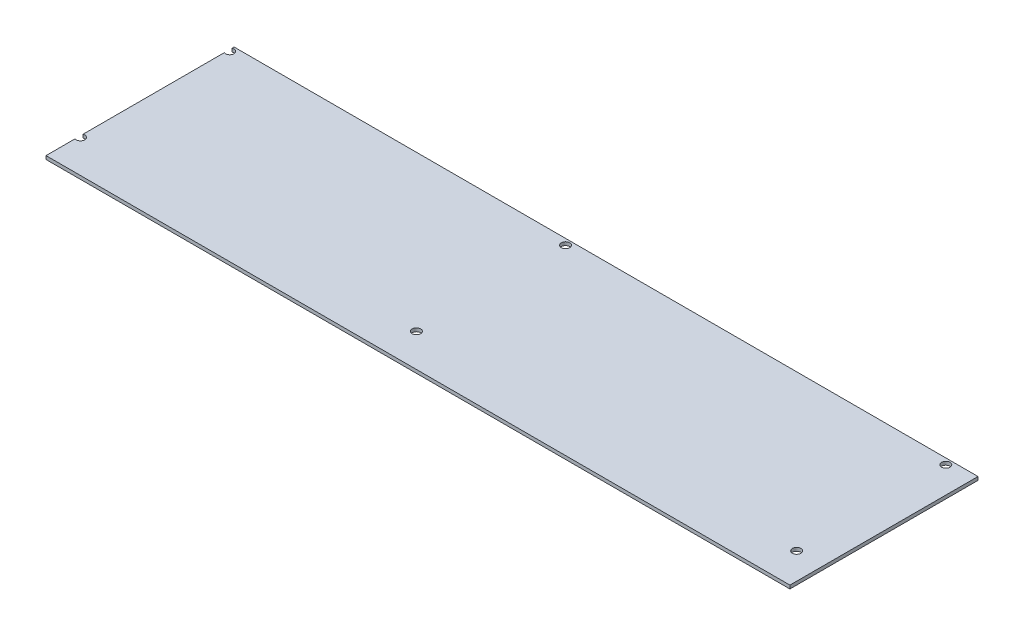
ISO-10303-21;
HEADER;
FILE_DESCRIPTION(('STEP AP214'),'2;1');
FILE_NAME('part.step','',(''),(''),'','','');
FILE_SCHEMA(('AUTOMOTIVE_DESIGN { 1 0 10303 214 1 1 1 1 }'));
ENDSEC;
DATA;
#1=APPLICATION_CONTEXT('core data for automotive mechanical design processes');
#2=APPLICATION_PROTOCOL_DEFINITION('international standard','automotive_design',2000,#1);
#3=PRODUCT_CONTEXT('',#1,'mechanical');
#4=PRODUCT('Part','Part','',(#3));
#5=PRODUCT_RELATED_PRODUCT_CATEGORY('part','',(#4));
#6=PRODUCT_DEFINITION_FORMATION('','',#4);
#7=PRODUCT_DEFINITION_CONTEXT('part definition',#1,'design');
#8=PRODUCT_DEFINITION('design','',#6,#7);
#9=PRODUCT_DEFINITION_SHAPE('','',#8);
#10=(LENGTH_UNIT() NAMED_UNIT(*) SI_UNIT(.MILLI.,.METRE.));
#11=(NAMED_UNIT(*) PLANE_ANGLE_UNIT() SI_UNIT($,.RADIAN.));
#12=(NAMED_UNIT(*) SI_UNIT($,.STERADIAN.) SOLID_ANGLE_UNIT());
#13=UNCERTAINTY_MEASURE_WITH_UNIT(LENGTH_MEASURE(1.E-05),#10,'distance_accuracy_value','');
#14=(GEOMETRIC_REPRESENTATION_CONTEXT(3) GLOBAL_UNCERTAINTY_ASSIGNED_CONTEXT((#13)) GLOBAL_UNIT_ASSIGNED_CONTEXT((#10,
#11,#12)) REPRESENTATION_CONTEXT('',''));
#15=CARTESIAN_POINT('',(0.,0.,0.));
#16=DIRECTION('',(0.,0.,1.));
#17=DIRECTION('',(1.,0.,0.));
#18=AXIS2_PLACEMENT_3D('',#15,#16,#17);
#19=CARTESIAN_POINT('',(0.,3.175,0.));
#20=DIRECTION('',(1.,0.,0.));
#21=DIRECTION('',(0.,0.,-1.));
#22=AXIS2_PLACEMENT_3D('',#19,#20,#21);
#23=PLANE('',#22);
#24=DIRECTION('',(0.,0.,1.));
#25=VECTOR('',#24,1.);
#26=CARTESIAN_POINT('',(0.,0.,0.));
#27=LINE('',#26,#25);
#28=CARTESIAN_POINT('',(0.,0.,0.));
#29=VERTEX_POINT('',#28);
#30=CARTESIAN_POINT('',(0.,0.,1.86950884320933));
#31=VERTEX_POINT('',#30);
#32=EDGE_CURVE('E130',#29,#31,#27,.T.);
#33=ORIENTED_EDGE('',*,*,#32,.T.);
#34=DIRECTION('',(0.,1.,0.));
#35=VECTOR('',#34,1.);
#36=CARTESIAN_POINT('',(0.,0.,1.86950884320933));
#37=LINE('',#36,#35);
#38=CARTESIAN_POINT('',(0.,3.175,1.86950884320933));
#39=VERTEX_POINT('',#38);
#40=EDGE_CURVE('E68',#31,#39,#37,.T.);
#41=ORIENTED_EDGE('',*,*,#40,.T.);
#42=DIRECTION('',(0.,0.,1.));
#43=VECTOR('',#42,1.);
#44=CARTESIAN_POINT('',(0.,3.175,0.));
#45=LINE('',#44,#43);
#46=CARTESIAN_POINT('',(0.,3.175,0.));
#47=VERTEX_POINT('',#46);
#48=EDGE_CURVE('E162',#47,#39,#45,.T.);
#49=ORIENTED_EDGE('',*,*,#48,.F.);
#50=DIRECTION('',(0.,-1.,0.));
#51=VECTOR('',#50,1.);
#52=CARTESIAN_POINT('',(0.,3.175,0.));
#53=LINE('',#52,#51);
#54=EDGE_CURVE('E148',#47,#29,#53,.T.);
#55=ORIENTED_EDGE('',*,*,#54,.T.);
#56=EDGE_LOOP('',(#33,#41,#49,#55));
#57=FACE_BOUND('',#56,.T.);
#58=ADVANCED_FACE('F45',(#57),#23,.F.);
#59=CARTESIAN_POINT('',(0.,3.175,9.24299115679058));
#60=VERTEX_POINT('',#59);
#61=CARTESIAN_POINT('',(0.,3.175,141.569508843243));
#62=VERTEX_POINT('',#61);
#63=EDGE_CURVE('E166',#60,#62,#45,.T.);
#64=ORIENTED_EDGE('',*,*,#63,.F.);
#65=DIRECTION('',(0.,1.,0.));
#66=VECTOR('',#65,1.);
#67=CARTESIAN_POINT('',(0.,0.,9.24299115679058));
#68=LINE('',#67,#66);
#69=CARTESIAN_POINT('',(0.,0.,9.24299115679058));
#70=VERTEX_POINT('',#69);
#71=EDGE_CURVE('E179',#60,#70,#68,.F.);
#72=ORIENTED_EDGE('',*,*,#71,.T.);
#73=CARTESIAN_POINT('',(0.,0.,141.569508843243));
#74=VERTEX_POINT('',#73);
#75=EDGE_CURVE('E127',#70,#74,#27,.T.);
#76=ORIENTED_EDGE('',*,*,#75,.T.);
#77=DIRECTION('',(0.,1.,0.));
#78=VECTOR('',#77,1.);
#79=CARTESIAN_POINT('',(0.,0.,141.569508843243));
#80=LINE('',#79,#78);
#81=EDGE_CURVE('E60',#74,#62,#80,.T.);
#82=ORIENTED_EDGE('',*,*,#81,.T.);
#83=EDGE_LOOP('',(#64,#72,#76,#82));
#84=FACE_BOUND('',#83,.T.);
#85=ADVANCED_FACE('F226',(#84),#23,.F.);
#86=CARTESIAN_POINT('',(0.,3.175,148.942991156824));
#87=VERTEX_POINT('',#86);
#88=CARTESIAN_POINT('',(0.,3.175,176.2125));
#89=VERTEX_POINT('',#88);
#90=EDGE_CURVE('E120',#87,#89,#45,.T.);
#91=ORIENTED_EDGE('',*,*,#90,.F.);
#92=DIRECTION('',(0.,1.,0.));
#93=VECTOR('',#92,1.);
#94=CARTESIAN_POINT('',(0.,0.,148.942991156824));
#95=LINE('',#94,#93);
#96=CARTESIAN_POINT('',(0.,0.,148.942991156824));
#97=VERTEX_POINT('',#96);
#98=EDGE_CURVE('E108',#87,#97,#95,.F.);
#99=ORIENTED_EDGE('',*,*,#98,.T.);
#100=CARTESIAN_POINT('',(0.,0.,176.2125));
#101=VERTEX_POINT('',#100);
#102=EDGE_CURVE('E118',#97,#101,#27,.T.);
#103=ORIENTED_EDGE('',*,*,#102,.T.);
#104=DIRECTION('',(0.,-1.,0.));
#105=VECTOR('',#104,1.);
#106=CARTESIAN_POINT('',(0.,3.175,176.2125));
#107=LINE('',#106,#105);
#108=EDGE_CURVE('E114',#89,#101,#107,.T.);
#109=ORIENTED_EDGE('',*,*,#108,.F.);
#110=EDGE_LOOP('',(#91,#99,#103,#109));
#111=FACE_BOUND('',#110,.T.);
#112=ADVANCED_FACE('F47',(#111),#23,.F.);
#113=CARTESIAN_POINT('',(0.,3.175,176.2125));
#114=DIRECTION('',(0.,0.,-1.));
#115=DIRECTION('',(-1.,0.,0.));
#116=AXIS2_PLACEMENT_3D('',#113,#114,#115);
#117=PLANE('',#116);
#118=DIRECTION('',(1.,0.,0.));
#119=VECTOR('',#118,1.);
#120=CARTESIAN_POINT('',(0.,0.,176.2125));
#121=LINE('',#120,#119);
#122=CARTESIAN_POINT('',(696.9125,0.,176.2125));
#123=VERTEX_POINT('',#122);
#124=EDGE_CURVE('E125',#101,#123,#121,.T.);
#125=ORIENTED_EDGE('',*,*,#124,.T.);
#126=DIRECTION('',(0.,-1.,0.));
#127=VECTOR('',#126,1.);
#128=CARTESIAN_POINT('',(696.9125,3.175,176.2125));
#129=LINE('',#128,#127);
#130=CARTESIAN_POINT('',(696.9125,3.175,176.2125));
#131=VERTEX_POINT('',#130);
#132=EDGE_CURVE('E154',#131,#123,#129,.T.);
#133=ORIENTED_EDGE('',*,*,#132,.F.);
#134=DIRECTION('',(1.,0.,0.));
#135=VECTOR('',#134,1.);
#136=CARTESIAN_POINT('',(0.,3.175,176.2125));
#137=LINE('',#136,#135);
#138=EDGE_CURVE('E158',#89,#131,#137,.T.);
#139=ORIENTED_EDGE('',*,*,#138,.F.);
#140=ORIENTED_EDGE('',*,*,#108,.T.);
#141=EDGE_LOOP('',(#125,#133,#139,#140));
#142=FACE_BOUND('',#141,.T.);
#143=ADVANCED_FACE('F157',(#142),#117,.F.);
#144=CARTESIAN_POINT('',(696.9125,3.175,0.));
#145=DIRECTION('',(-1.,0.,0.));
#146=DIRECTION('',(0.,0.,1.));
#147=AXIS2_PLACEMENT_3D('',#144,#145,#146);
#148=PLANE('',#147);
#149=DIRECTION('',(0.,0.,-1.));
#150=VECTOR('',#149,1.);
#151=CARTESIAN_POINT('',(696.9125,0.,0.));
#152=LINE('',#151,#150);
#153=CARTESIAN_POINT('',(696.9125,0.,0.));
#154=VERTEX_POINT('',#153);
#155=EDGE_CURVE('E140',#123,#154,#152,.T.);
#156=ORIENTED_EDGE('',*,*,#155,.T.);
#157=DIRECTION('',(0.,-1.,0.));
#158=VECTOR('',#157,1.);
#159=CARTESIAN_POINT('',(696.9125,3.175,0.));
#160=LINE('',#159,#158);
#161=CARTESIAN_POINT('',(696.9125,3.175,0.));
#162=VERTEX_POINT('',#161);
#163=EDGE_CURVE('E150',#162,#154,#160,.T.);
#164=ORIENTED_EDGE('',*,*,#163,.F.);
#165=DIRECTION('',(0.,0.,-1.));
#166=VECTOR('',#165,1.);
#167=CARTESIAN_POINT('',(696.9125,3.175,0.));
#168=LINE('',#167,#166);
#169=EDGE_CURVE('E161',#131,#162,#168,.T.);
#170=ORIENTED_EDGE('',*,*,#169,.F.);
#171=ORIENTED_EDGE('',*,*,#132,.T.);
#172=EDGE_LOOP('',(#156,#164,#170,#171));
#173=FACE_BOUND('',#172,.T.);
#174=ADVANCED_FACE('F228',(#173),#148,.F.);
#175=CARTESIAN_POINT('',(0.,3.175,0.));
#176=DIRECTION('',(0.,0.,1.));
#177=DIRECTION('',(1.,0.,0.));
#178=AXIS2_PLACEMENT_3D('',#175,#176,#177);
#179=PLANE('',#178);
#180=DIRECTION('',(-1.,0.,0.));
#181=VECTOR('',#180,1.);
#182=CARTESIAN_POINT('',(0.,0.,0.));
#183=LINE('',#182,#181);
#184=EDGE_CURVE('E144',#154,#29,#183,.T.);
#185=ORIENTED_EDGE('',*,*,#184,.T.);
#186=ORIENTED_EDGE('',*,*,#54,.F.);
#187=DIRECTION('',(-1.,0.,0.));
#188=VECTOR('',#187,1.);
#189=CARTESIAN_POINT('',(0.,3.175,0.));
#190=LINE('',#189,#188);
#191=EDGE_CURVE('E151',#162,#47,#190,.T.);
#192=ORIENTED_EDGE('',*,*,#191,.F.);
#193=ORIENTED_EDGE('',*,*,#163,.T.);
#194=EDGE_LOOP('',(#185,#186,#192,#193));
#195=FACE_BOUND('',#194,.T.);
#196=ADVANCED_FACE('F176',(#195),#179,.F.);
#197=CARTESIAN_POINT('',(0.,3.175,0.));
#198=DIRECTION('',(0.,1.,0.));
#199=DIRECTION('',(0.,0.,1.));
#200=AXIS2_PLACEMENT_3D('',#197,#198,#199);
#201=PLANE('',#200);
#202=CARTESIAN_POINT('',(316.049800214591,3.175,145.256250000028));
#203=DIRECTION('',(0.,1.,0.));
#204=DIRECTION('',(0.,0.,1.));
#205=AXIS2_PLACEMENT_3D('',#202,#203,#204);
#206=CIRCLE('',#205,3.96874999999998);
#207=CARTESIAN_POINT('',(316.049800214591,3.175,149.225000000028));
#208=VERTEX_POINT('',#207);
#209=EDGE_CURVE('E128',#208,#208,#206,.T.);
#210=ORIENTED_EDGE('',*,*,#209,.F.);
#211=EDGE_LOOP('',(#210));
#212=FACE_BOUND('',#211,.T.);
#213=CARTESIAN_POINT('',(672.30625,3.175,145.256250000017));
#214=DIRECTION('',(0.,1.,0.));
#215=DIRECTION('',(0.,0.,1.));
#216=AXIS2_PLACEMENT_3D('',#213,#214,#215);
#217=CIRCLE('',#216,3.9687500000001);
#218=CARTESIAN_POINT('',(672.30625,3.175,149.225000000017));
#219=VERTEX_POINT('',#218);
#220=EDGE_CURVE('E132',#219,#219,#217,.T.);
#221=ORIENTED_EDGE('',*,*,#220,.F.);
#222=EDGE_LOOP('',(#221));
#223=FACE_BOUND('',#222,.T.);
#224=CARTESIAN_POINT('',(316.049800214591,3.175,5.55625000000552));
#225=DIRECTION('',(0.,1.,0.));
#226=DIRECTION('',(0.,0.,1.));
#227=AXIS2_PLACEMENT_3D('',#224,#225,#226);
#228=CIRCLE('',#227,3.96874999999999);
#229=CARTESIAN_POINT('',(316.049800214591,3.175,9.52500000000551));
#230=VERTEX_POINT('',#229);
#231=EDGE_CURVE('E178',#230,#230,#228,.T.);
#232=ORIENTED_EDGE('',*,*,#231,.F.);
#233=EDGE_LOOP('',(#232));
#234=FACE_BOUND('',#233,.T.);
#235=CARTESIAN_POINT('',(1.4693250849715,3.175,5.55624999999996));
#236=DIRECTION('',(0.,1.,0.));
#237=DIRECTION('',(0.,0.,1.));
#238=AXIS2_PLACEMENT_3D('',#235,#236,#237);
#239=CIRCLE('',#238,3.96875000000005);
#240=EDGE_CURVE('E184',#60,#39,#239,.T.);
#241=ORIENTED_EDGE('',*,*,#240,.F.);
#242=ORIENTED_EDGE('',*,*,#63,.T.);
#243=CARTESIAN_POINT('',(1.4693250849715,3.175,145.256250000033));
#244=DIRECTION('',(0.,1.,0.));
#245=DIRECTION('',(0.,0.,1.));
#246=AXIS2_PLACEMENT_3D('',#243,#244,#245);
#247=CIRCLE('',#246,3.96875000000006);
#248=EDGE_CURVE('E121',#87,#62,#247,.T.);
#249=ORIENTED_EDGE('',*,*,#248,.F.);
#250=ORIENTED_EDGE('',*,*,#90,.T.);
#251=ORIENTED_EDGE('',*,*,#138,.T.);
#252=ORIENTED_EDGE('',*,*,#169,.T.);
#253=ORIENTED_EDGE('',*,*,#191,.T.);
#254=ORIENTED_EDGE('',*,*,#48,.T.);
#255=EDGE_LOOP('',(#241,#242,#249,#250,#251,#252,#253,#254));
#256=FACE_BOUND('',#255,.T.);
#257=CARTESIAN_POINT('',(672.30625,3.175,5.55625000001661));
#258=DIRECTION('',(0.,1.,0.));
#259=DIRECTION('',(0.,0.,1.));
#260=AXIS2_PLACEMENT_3D('',#257,#258,#259);
#261=CIRCLE('',#260,3.9687500000001);
#262=CARTESIAN_POINT('',(672.30625,3.175,9.52500000001671));
#263=VERTEX_POINT('',#262);
#264=EDGE_CURVE('E219',#263,#263,#261,.T.);
#265=ORIENTED_EDGE('',*,*,#264,.F.);
#266=EDGE_LOOP('',(#265));
#267=FACE_BOUND('',#266,.T.);
#268=ADVANCED_FACE('F171',(#212,#223,#234,#256,#267),#201,.T.);
#269=CARTESIAN_POINT('',(0.,0.,0.));
#270=DIRECTION('',(0.,1.,0.));
#271=DIRECTION('',(0.,0.,1.));
#272=AXIS2_PLACEMENT_3D('',#269,#270,#271);
#273=PLANE('',#272);
#274=CARTESIAN_POINT('',(316.049800214591,0.,145.256250000028));
#275=DIRECTION('',(0.,1.,0.));
#276=DIRECTION('',(0.,0.,-1.));
#277=AXIS2_PLACEMENT_3D('',#274,#275,#276);
#278=CIRCLE('',#277,3.96874999999998);
#279=CARTESIAN_POINT('',(316.049800214591,0.,149.225000000028));
#280=VERTEX_POINT('',#279);
#281=EDGE_CURVE('E212',#280,#280,#278,.T.);
#282=ORIENTED_EDGE('',*,*,#281,.T.);
#283=EDGE_LOOP('',(#282));
#284=FACE_BOUND('',#283,.T.);
#285=CARTESIAN_POINT('',(672.30625,0.,145.256250000017));
#286=DIRECTION('',(0.,1.,0.));
#287=DIRECTION('',(0.,0.,-1.));
#288=AXIS2_PLACEMENT_3D('',#285,#286,#287);
#289=CIRCLE('',#288,3.9687500000001);
#290=CARTESIAN_POINT('',(672.30625,0.,149.225000000017));
#291=VERTEX_POINT('',#290);
#292=EDGE_CURVE('E209',#291,#291,#289,.T.);
#293=ORIENTED_EDGE('',*,*,#292,.T.);
#294=EDGE_LOOP('',(#293));
#295=FACE_BOUND('',#294,.T.);
#296=CARTESIAN_POINT('',(316.049800214591,0.,5.55625000000552));
#297=DIRECTION('',(0.,1.,0.));
#298=DIRECTION('',(0.,0.,1.));
#299=AXIS2_PLACEMENT_3D('',#296,#297,#298);
#300=CIRCLE('',#299,3.96874999999999);
#301=CARTESIAN_POINT('',(316.049800214591,0.,9.52500000000551));
#302=VERTEX_POINT('',#301);
#303=EDGE_CURVE('E207',#302,#302,#300,.T.);
#304=ORIENTED_EDGE('',*,*,#303,.T.);
#305=EDGE_LOOP('',(#304));
#306=FACE_BOUND('',#305,.T.);
#307=CARTESIAN_POINT('',(672.30625,0.,5.55625000001661));
#308=DIRECTION('',(0.,1.,0.));
#309=DIRECTION('',(0.,0.,1.));
#310=AXIS2_PLACEMENT_3D('',#307,#308,#309);
#311=CIRCLE('',#310,3.9687500000001);
#312=CARTESIAN_POINT('',(672.30625,0.,9.52500000001671));
#313=VERTEX_POINT('',#312);
#314=EDGE_CURVE('E216',#313,#313,#311,.T.);
#315=ORIENTED_EDGE('',*,*,#314,.T.);
#316=EDGE_LOOP('',(#315));
#317=FACE_BOUND('',#316,.T.);
#318=ORIENTED_EDGE('',*,*,#75,.F.);
#319=CARTESIAN_POINT('',(1.4693250849715,0.,5.55624999999996));
#320=DIRECTION('',(0.,1.,0.));
#321=DIRECTION('',(0.,0.,1.));
#322=AXIS2_PLACEMENT_3D('',#319,#320,#321);
#323=CIRCLE('',#322,3.96875000000005);
#324=EDGE_CURVE('E11',#70,#31,#323,.T.);
#325=ORIENTED_EDGE('',*,*,#324,.T.);
#326=ORIENTED_EDGE('',*,*,#32,.F.);
#327=ORIENTED_EDGE('',*,*,#184,.F.);
#328=ORIENTED_EDGE('',*,*,#155,.F.);
#329=ORIENTED_EDGE('',*,*,#124,.F.);
#330=ORIENTED_EDGE('',*,*,#102,.F.);
#331=CARTESIAN_POINT('',(1.4693250849715,0.,145.256250000033));
#332=DIRECTION('',(0.,1.,0.));
#333=DIRECTION('',(0.,0.,1.));
#334=AXIS2_PLACEMENT_3D('',#331,#332,#333);
#335=CIRCLE('',#334,3.96875000000006);
#336=EDGE_CURVE('E53',#97,#74,#335,.T.);
#337=ORIENTED_EDGE('',*,*,#336,.T.);
#338=EDGE_LOOP('',(#318,#325,#326,#327,#328,#329,#330,#337));
#339=FACE_BOUND('',#338,.T.);
#340=ADVANCED_FACE('F123',(#284,#295,#306,#317,#339),#273,.F.);
#341=CARTESIAN_POINT('',(672.30625,0.,5.55625000001661));
#342=DIRECTION('',(0.,1.,0.));
#343=DIRECTION('',(0.,0.,1.));
#344=AXIS2_PLACEMENT_3D('',#341,#342,#343);
#345=CYLINDRICAL_SURFACE('',#344,3.9687500000001);
#346=CARTESIAN_POINT('',(672.30625,3.175,9.52500000001671));
#347=CARTESIAN_POINT('',(672.30625,3.14192708333333,9.52500000001671));
#348=CARTESIAN_POINT('',(672.30625,3.10885416666667,9.52500000001671));
#349=CARTESIAN_POINT('',(672.30625,3.04270833333333,9.52500000001671));
#350=CARTESIAN_POINT('',(672.30625,3.00963541666667,9.52500000001671));
#351=CARTESIAN_POINT('',(672.30625,2.94348958333333,9.52500000001671));
#352=CARTESIAN_POINT('',(672.30625,2.91041666666667,9.52500000001671));
#353=CARTESIAN_POINT('',(672.30625,2.84427083333333,9.52500000001671));
#354=CARTESIAN_POINT('',(672.30625,2.81119791666667,9.52500000001671));
#355=CARTESIAN_POINT('',(672.30625,2.74505208333333,9.52500000001671));
#356=CARTESIAN_POINT('',(672.30625,2.71197916666667,9.52500000001671));
#357=CARTESIAN_POINT('',(672.30625,2.64583333333333,9.52500000001671));
#358=CARTESIAN_POINT('',(672.30625,2.61276041666667,9.52500000001671));
#359=CARTESIAN_POINT('',(672.30625,2.54661458333333,9.52500000001671));
#360=CARTESIAN_POINT('',(672.30625,2.51354166666667,9.52500000001671));
#361=CARTESIAN_POINT('',(672.30625,2.44739583333333,9.52500000001671));
#362=CARTESIAN_POINT('',(672.30625,2.41432291666667,9.52500000001671));
#363=CARTESIAN_POINT('',(672.30625,2.34817708333333,9.52500000001671));
#364=CARTESIAN_POINT('',(672.30625,2.31510416666667,9.52500000001671));
#365=CARTESIAN_POINT('',(672.30625,2.24895833333333,9.52500000001671));
#366=CARTESIAN_POINT('',(672.30625,2.21588541666667,9.52500000001671));
#367=CARTESIAN_POINT('',(672.30625,2.14973958333333,9.52500000001671));
#368=CARTESIAN_POINT('',(672.30625,2.11666666666667,9.52500000001671));
#369=CARTESIAN_POINT('',(672.30625,2.05052083333333,9.52500000001671));
#370=CARTESIAN_POINT('',(672.30625,2.01744791666667,9.52500000001671));
#371=CARTESIAN_POINT('',(672.30625,1.95130208333333,9.52500000001671));
#372=CARTESIAN_POINT('',(672.30625,1.91822916666667,9.52500000001671));
#373=CARTESIAN_POINT('',(672.30625,1.85208333333333,9.52500000001671));
#374=CARTESIAN_POINT('',(672.30625,1.81901041666667,9.52500000001671));
#375=CARTESIAN_POINT('',(672.30625,1.75286458333333,9.52500000001671));
#376=CARTESIAN_POINT('',(672.30625,1.71979166666667,9.52500000001671));
#377=CARTESIAN_POINT('',(672.30625,1.65364583333333,9.52500000001671));
#378=CARTESIAN_POINT('',(672.30625,1.62057291666667,9.52500000001671));
#379=CARTESIAN_POINT('',(672.30625,1.55442708333333,9.52500000001671));
#380=CARTESIAN_POINT('',(672.30625,1.52135416666667,9.52500000001671));
#381=CARTESIAN_POINT('',(672.30625,1.45520833333333,9.52500000001671));
#382=CARTESIAN_POINT('',(672.30625,1.42213541666667,9.52500000001671));
#383=CARTESIAN_POINT('',(672.30625,1.35598958333333,9.52500000001671));
#384=CARTESIAN_POINT('',(672.30625,1.32291666666667,9.52500000001671));
#385=CARTESIAN_POINT('',(672.30625,1.25677083333333,9.52500000001671));
#386=CARTESIAN_POINT('',(672.30625,1.22369791666667,9.52500000001671));
#387=CARTESIAN_POINT('',(672.30625,1.15755208333333,9.52500000001671));
#388=CARTESIAN_POINT('',(672.30625,1.12447916666667,9.52500000001671));
#389=CARTESIAN_POINT('',(672.30625,1.05833333333333,9.52500000001671));
#390=CARTESIAN_POINT('',(672.30625,1.02526041666667,9.52500000001671));
#391=CARTESIAN_POINT('',(672.30625,0.959114583333333,9.52500000001671));
#392=CARTESIAN_POINT('',(672.30625,0.926041666666667,9.52500000001671));
#393=CARTESIAN_POINT('',(672.30625,0.859895833333333,9.52500000001671));
#394=CARTESIAN_POINT('',(672.30625,0.826822916666667,9.52500000001671));
#395=CARTESIAN_POINT('',(672.30625,0.760677083333333,9.52500000001671));
#396=CARTESIAN_POINT('',(672.30625,0.727604166666666,9.52500000001671));
#397=CARTESIAN_POINT('',(672.30625,0.661458333333333,9.52500000001671));
#398=CARTESIAN_POINT('',(672.30625,0.628385416666666,9.52500000001671));
#399=CARTESIAN_POINT('',(672.30625,0.562239583333333,9.52500000001671));
#400=CARTESIAN_POINT('',(672.30625,0.529166666666666,9.52500000001671));
#401=CARTESIAN_POINT('',(672.30625,0.463020833333333,9.52500000001671));
#402=CARTESIAN_POINT('',(672.30625,0.429947916666667,9.52500000001671));
#403=CARTESIAN_POINT('',(672.30625,0.363802083333333,9.52500000001671));
#404=CARTESIAN_POINT('',(672.30625,0.330729166666667,9.52500000001671));
#405=CARTESIAN_POINT('',(672.30625,0.264583333333333,9.52500000001671));
#406=CARTESIAN_POINT('',(672.30625,0.231510416666667,9.52500000001671));
#407=CARTESIAN_POINT('',(672.30625,0.165364583333333,9.52500000001671));
#408=CARTESIAN_POINT('',(672.30625,0.132291666666667,9.52500000001671));
#409=CARTESIAN_POINT('',(672.30625,0.0661458333333333,9.52500000001671));
#410=CARTESIAN_POINT('',(672.30625,0.0330729166666666,9.52500000001671));
#411=CARTESIAN_POINT('',(672.30625,0.,9.52500000001671));
#412=B_SPLINE_CURVE_WITH_KNOTS('',3,(#346,#347,#348,#349,#350,#351,#352,#353,#354,#355,#356,
#357,#358,#359,#360,#361,#362,#363,#364,#365,#366,#367,#368,#369,#370,#371,#372,#373,#374,#375,
#376,#377,#378,#379,#380,#381,#382,#383,#384,#385,#386,#387,#388,#389,#390,#391,#392,#393,#394,
#395,#396,#397,#398,#399,#400,#401,#402,#403,#404,#405,#406,#407,#408,#409,#410,#411),
.UNSPECIFIED.,.F.,.F.,(4,2,2,2,2,2,2,2,2,2,2,2,2,2,2,2,2,2,2,2,2,2,2,2,2,2,2,2,2,2,2,2,4),(0.,
0.0992187499999999,0.1984375,0.29765625,0.396875,0.49609375,0.5953125,0.69453125,0.79375,
0.89296875,0.9921875,1.09140625,1.190625,1.28984375,1.3890625,1.48828125,1.5875,1.68671875,
1.7859375,1.88515625,1.984375,2.08359375,2.1828125,2.28203125,2.38125,2.48046875,2.5796875,
2.67890625,2.778125,2.87734375,2.9765625,3.07578125,3.175),.UNSPECIFIED.);
#413=EDGE_CURVE('BSEAM259',#263,#313,#412,.T.);
#414=ORIENTED_EDGE('',*,*,#264,.T.);
#415=ORIENTED_EDGE('',*,*,#314,.F.);
#416=ORIENTED_EDGE('',*,*,#413,.T.);
#417=ORIENTED_EDGE('',*,*,#413,.F.);
#418=EDGE_LOOP('',(#414,#416,#415,#417));
#419=FACE_BOUND('',#418,.T.);
#420=ADVANCED_FACE('F259',(#419),#345,.F.);
#421=CARTESIAN_POINT('',(1.4693250849715,0.,145.256250000033));
#422=DIRECTION('',(0.,1.,0.));
#423=DIRECTION('',(0.,0.,1.));
#424=AXIS2_PLACEMENT_3D('',#421,#422,#423);
#425=CYLINDRICAL_SURFACE('',#424,3.96875000000006);
#426=ORIENTED_EDGE('',*,*,#336,.F.);
#427=ORIENTED_EDGE('',*,*,#98,.F.);
#428=ORIENTED_EDGE('',*,*,#248,.T.);
#429=ORIENTED_EDGE('',*,*,#81,.F.);
#430=EDGE_LOOP('',(#426,#427,#428,#429));
#431=FACE_BOUND('',#430,.T.);
#432=ADVANCED_FACE('F107',(#431),#425,.F.);
#433=CARTESIAN_POINT('',(1.4693250849715,0.,5.55624999999996));
#434=DIRECTION('',(0.,1.,0.));
#435=DIRECTION('',(0.,0.,1.));
#436=AXIS2_PLACEMENT_3D('',#433,#434,#435);
#437=CYLINDRICAL_SURFACE('',#436,3.96875000000005);
#438=ORIENTED_EDGE('',*,*,#324,.F.);
#439=ORIENTED_EDGE('',*,*,#71,.F.);
#440=ORIENTED_EDGE('',*,*,#240,.T.);
#441=ORIENTED_EDGE('',*,*,#40,.F.);
#442=EDGE_LOOP('',(#438,#439,#440,#441));
#443=FACE_BOUND('',#442,.T.);
#444=ADVANCED_FACE('F203',(#443),#437,.F.);
#445=CARTESIAN_POINT('',(316.049800214591,0.,5.55625000000552));
#446=DIRECTION('',(0.,1.,0.));
#447=DIRECTION('',(0.,0.,1.));
#448=AXIS2_PLACEMENT_3D('',#445,#446,#447);
#449=CYLINDRICAL_SURFACE('',#448,3.96874999999999);
#450=CARTESIAN_POINT('',(316.049800214591,3.175,9.52500000000551));
#451=CARTESIAN_POINT('',(316.049800214591,3.14192708333333,9.52500000000551));
#452=CARTESIAN_POINT('',(316.049800214591,3.10885416666667,9.52500000000551));
#453=CARTESIAN_POINT('',(316.049800214591,3.04270833333333,9.52500000000551));
#454=CARTESIAN_POINT('',(316.049800214591,3.00963541666667,9.52500000000551));
#455=CARTESIAN_POINT('',(316.049800214591,2.94348958333333,9.52500000000551));
#456=CARTESIAN_POINT('',(316.049800214591,2.91041666666667,9.52500000000551));
#457=CARTESIAN_POINT('',(316.049800214591,2.84427083333333,9.52500000000551));
#458=CARTESIAN_POINT('',(316.049800214591,2.81119791666667,9.52500000000551));
#459=CARTESIAN_POINT('',(316.049800214591,2.74505208333333,9.52500000000551));
#460=CARTESIAN_POINT('',(316.049800214591,2.71197916666667,9.52500000000551));
#461=CARTESIAN_POINT('',(316.049800214591,2.64583333333333,9.52500000000551));
#462=CARTESIAN_POINT('',(316.049800214591,2.61276041666667,9.52500000000551));
#463=CARTESIAN_POINT('',(316.049800214591,2.54661458333333,9.52500000000551));
#464=CARTESIAN_POINT('',(316.049800214591,2.51354166666667,9.52500000000551));
#465=CARTESIAN_POINT('',(316.049800214591,2.44739583333333,9.52500000000551));
#466=CARTESIAN_POINT('',(316.049800214591,2.41432291666667,9.52500000000551));
#467=CARTESIAN_POINT('',(316.049800214591,2.34817708333333,9.52500000000551));
#468=CARTESIAN_POINT('',(316.049800214591,2.31510416666667,9.52500000000551));
#469=CARTESIAN_POINT('',(316.049800214591,2.24895833333333,9.52500000000551));
#470=CARTESIAN_POINT('',(316.049800214591,2.21588541666667,9.52500000000551));
#471=CARTESIAN_POINT('',(316.049800214591,2.14973958333333,9.52500000000551));
#472=CARTESIAN_POINT('',(316.049800214591,2.11666666666667,9.52500000000551));
#473=CARTESIAN_POINT('',(316.049800214591,2.05052083333333,9.52500000000551));
#474=CARTESIAN_POINT('',(316.049800214591,2.01744791666667,9.52500000000551));
#475=CARTESIAN_POINT('',(316.049800214591,1.95130208333333,9.52500000000551));
#476=CARTESIAN_POINT('',(316.049800214591,1.91822916666667,9.52500000000551));
#477=CARTESIAN_POINT('',(316.049800214591,1.85208333333333,9.52500000000551));
#478=CARTESIAN_POINT('',(316.049800214591,1.81901041666667,9.52500000000551));
#479=CARTESIAN_POINT('',(316.049800214591,1.75286458333333,9.52500000000551));
#480=CARTESIAN_POINT('',(316.049800214591,1.71979166666667,9.52500000000551));
#481=CARTESIAN_POINT('',(316.049800214591,1.65364583333333,9.52500000000551));
#482=CARTESIAN_POINT('',(316.049800214591,1.62057291666667,9.52500000000551));
#483=CARTESIAN_POINT('',(316.049800214591,1.55442708333333,9.52500000000551));
#484=CARTESIAN_POINT('',(316.049800214591,1.52135416666667,9.52500000000551));
#485=CARTESIAN_POINT('',(316.049800214591,1.45520833333333,9.52500000000551));
#486=CARTESIAN_POINT('',(316.049800214591,1.42213541666667,9.52500000000551));
#487=CARTESIAN_POINT('',(316.049800214591,1.35598958333333,9.52500000000551));
#488=CARTESIAN_POINT('',(316.049800214591,1.32291666666667,9.52500000000551));
#489=CARTESIAN_POINT('',(316.049800214591,1.25677083333333,9.52500000000551));
#490=CARTESIAN_POINT('',(316.049800214591,1.22369791666667,9.52500000000551));
#491=CARTESIAN_POINT('',(316.049800214591,1.15755208333333,9.52500000000551));
#492=CARTESIAN_POINT('',(316.049800214591,1.12447916666667,9.52500000000551));
#493=CARTESIAN_POINT('',(316.049800214591,1.05833333333333,9.52500000000551));
#494=CARTESIAN_POINT('',(316.049800214591,1.02526041666667,9.52500000000551));
#495=CARTESIAN_POINT('',(316.049800214591,0.959114583333333,9.52500000000551));
#496=CARTESIAN_POINT('',(316.049800214591,0.926041666666667,9.52500000000551));
#497=CARTESIAN_POINT('',(316.049800214591,0.859895833333333,9.52500000000551));
#498=CARTESIAN_POINT('',(316.049800214591,0.826822916666667,9.52500000000551));
#499=CARTESIAN_POINT('',(316.049800214591,0.760677083333333,9.52500000000551));
#500=CARTESIAN_POINT('',(316.049800214591,0.727604166666666,9.52500000000551));
#501=CARTESIAN_POINT('',(316.049800214591,0.661458333333333,9.52500000000551));
#502=CARTESIAN_POINT('',(316.049800214591,0.628385416666666,9.52500000000551));
#503=CARTESIAN_POINT('',(316.049800214591,0.562239583333333,9.52500000000551));
#504=CARTESIAN_POINT('',(316.049800214591,0.529166666666666,9.52500000000551));
#505=CARTESIAN_POINT('',(316.049800214591,0.463020833333333,9.52500000000551));
#506=CARTESIAN_POINT('',(316.049800214591,0.429947916666667,9.52500000000551));
#507=CARTESIAN_POINT('',(316.049800214591,0.363802083333333,9.52500000000551));
#508=CARTESIAN_POINT('',(316.049800214591,0.330729166666667,9.52500000000551));
#509=CARTESIAN_POINT('',(316.049800214591,0.264583333333333,9.52500000000551));
#510=CARTESIAN_POINT('',(316.049800214591,0.231510416666667,9.52500000000551));
#511=CARTESIAN_POINT('',(316.049800214591,0.165364583333333,9.52500000000551));
#512=CARTESIAN_POINT('',(316.049800214591,0.132291666666667,9.52500000000551));
#513=CARTESIAN_POINT('',(316.049800214591,0.0661458333333333,9.52500000000551));
#514=CARTESIAN_POINT('',(316.049800214591,0.0330729166666666,9.52500000000551));
#515=CARTESIAN_POINT('',(316.049800214591,0.,9.52500000000551));
#516=B_SPLINE_CURVE_WITH_KNOTS('',3,(#450,#451,#452,#453,#454,#455,#456,#457,#458,#459,#460,
#461,#462,#463,#464,#465,#466,#467,#468,#469,#470,#471,#472,#473,#474,#475,#476,#477,#478,#479,
#480,#481,#482,#483,#484,#485,#486,#487,#488,#489,#490,#491,#492,#493,#494,#495,#496,#497,#498,
#499,#500,#501,#502,#503,#504,#505,#506,#507,#508,#509,#510,#511,#512,#513,#514,#515),
.UNSPECIFIED.,.F.,.F.,(4,2,2,2,2,2,2,2,2,2,2,2,2,2,2,2,2,2,2,2,2,2,2,2,2,2,2,2,2,2,2,2,4),(0.,
0.0992187499999999,0.1984375,0.29765625,0.396875,0.49609375,0.5953125,0.69453125,0.79375,
0.89296875,0.9921875,1.09140625,1.190625,1.28984375,1.3890625,1.48828125,1.5875,1.68671875,
1.7859375,1.88515625,1.984375,2.08359375,2.1828125,2.28203125,2.38125,2.48046875,2.5796875,
2.67890625,2.778125,2.87734375,2.9765625,3.07578125,3.175),.UNSPECIFIED.);
#517=EDGE_CURVE('BSEAM200',#230,#302,#516,.T.);
#518=ORIENTED_EDGE('',*,*,#231,.T.);
#519=ORIENTED_EDGE('',*,*,#303,.F.);
#520=ORIENTED_EDGE('',*,*,#517,.T.);
#521=ORIENTED_EDGE('',*,*,#517,.F.);
#522=EDGE_LOOP('',(#518,#520,#519,#521));
#523=FACE_BOUND('',#522,.T.);
#524=ADVANCED_FACE('F200',(#523),#449,.F.);
#525=CARTESIAN_POINT('',(672.30625,0.,145.256250000017));
#526=DIRECTION('',(0.,1.,0.));
#527=DIRECTION('',(0.,0.,1.));
#528=AXIS2_PLACEMENT_3D('',#525,#526,#527);
#529=CYLINDRICAL_SURFACE('',#528,3.9687500000001);
#530=CARTESIAN_POINT('',(672.30625,3.175,149.225000000017));
#531=CARTESIAN_POINT('',(672.30625,3.14192708333333,149.225000000017));
#532=CARTESIAN_POINT('',(672.30625,3.10885416666667,149.225000000017));
#533=CARTESIAN_POINT('',(672.30625,3.04270833333333,149.225000000017));
#534=CARTESIAN_POINT('',(672.30625,3.00963541666667,149.225000000017));
#535=CARTESIAN_POINT('',(672.30625,2.94348958333333,149.225000000017));
#536=CARTESIAN_POINT('',(672.30625,2.91041666666667,149.225000000017));
#537=CARTESIAN_POINT('',(672.30625,2.84427083333333,149.225000000017));
#538=CARTESIAN_POINT('',(672.30625,2.81119791666667,149.225000000017));
#539=CARTESIAN_POINT('',(672.30625,2.74505208333333,149.225000000017));
#540=CARTESIAN_POINT('',(672.30625,2.71197916666667,149.225000000017));
#541=CARTESIAN_POINT('',(672.30625,2.64583333333333,149.225000000017));
#542=CARTESIAN_POINT('',(672.30625,2.61276041666667,149.225000000017));
#543=CARTESIAN_POINT('',(672.30625,2.54661458333333,149.225000000017));
#544=CARTESIAN_POINT('',(672.30625,2.51354166666667,149.225000000017));
#545=CARTESIAN_POINT('',(672.30625,2.44739583333333,149.225000000017));
#546=CARTESIAN_POINT('',(672.30625,2.41432291666667,149.225000000017));
#547=CARTESIAN_POINT('',(672.30625,2.34817708333333,149.225000000017));
#548=CARTESIAN_POINT('',(672.30625,2.31510416666667,149.225000000017));
#549=CARTESIAN_POINT('',(672.30625,2.24895833333333,149.225000000017));
#550=CARTESIAN_POINT('',(672.30625,2.21588541666667,149.225000000017));
#551=CARTESIAN_POINT('',(672.30625,2.14973958333333,149.225000000017));
#552=CARTESIAN_POINT('',(672.30625,2.11666666666667,149.225000000017));
#553=CARTESIAN_POINT('',(672.30625,2.05052083333333,149.225000000017));
#554=CARTESIAN_POINT('',(672.30625,2.01744791666667,149.225000000017));
#555=CARTESIAN_POINT('',(672.30625,1.95130208333333,149.225000000017));
#556=CARTESIAN_POINT('',(672.30625,1.91822916666667,149.225000000017));
#557=CARTESIAN_POINT('',(672.30625,1.85208333333333,149.225000000017));
#558=CARTESIAN_POINT('',(672.30625,1.81901041666667,149.225000000017));
#559=CARTESIAN_POINT('',(672.30625,1.75286458333333,149.225000000017));
#560=CARTESIAN_POINT('',(672.30625,1.71979166666667,149.225000000017));
#561=CARTESIAN_POINT('',(672.30625,1.65364583333333,149.225000000017));
#562=CARTESIAN_POINT('',(672.30625,1.62057291666667,149.225000000017));
#563=CARTESIAN_POINT('',(672.30625,1.55442708333333,149.225000000017));
#564=CARTESIAN_POINT('',(672.30625,1.52135416666667,149.225000000017));
#565=CARTESIAN_POINT('',(672.30625,1.45520833333333,149.225000000017));
#566=CARTESIAN_POINT('',(672.30625,1.42213541666667,149.225000000017));
#567=CARTESIAN_POINT('',(672.30625,1.35598958333333,149.225000000017));
#568=CARTESIAN_POINT('',(672.30625,1.32291666666667,149.225000000017));
#569=CARTESIAN_POINT('',(672.30625,1.25677083333333,149.225000000017));
#570=CARTESIAN_POINT('',(672.30625,1.22369791666667,149.225000000017));
#571=CARTESIAN_POINT('',(672.30625,1.15755208333333,149.225000000017));
#572=CARTESIAN_POINT('',(672.30625,1.12447916666667,149.225000000017));
#573=CARTESIAN_POINT('',(672.30625,1.05833333333333,149.225000000017));
#574=CARTESIAN_POINT('',(672.30625,1.02526041666667,149.225000000017));
#575=CARTESIAN_POINT('',(672.30625,0.959114583333333,149.225000000017));
#576=CARTESIAN_POINT('',(672.30625,0.926041666666667,149.225000000017));
#577=CARTESIAN_POINT('',(672.30625,0.859895833333333,149.225000000017));
#578=CARTESIAN_POINT('',(672.30625,0.826822916666667,149.225000000017));
#579=CARTESIAN_POINT('',(672.30625,0.760677083333333,149.225000000017));
#580=CARTESIAN_POINT('',(672.30625,0.727604166666666,149.225000000017));
#581=CARTESIAN_POINT('',(672.30625,0.661458333333333,149.225000000017));
#582=CARTESIAN_POINT('',(672.30625,0.628385416666666,149.225000000017));
#583=CARTESIAN_POINT('',(672.30625,0.562239583333333,149.225000000017));
#584=CARTESIAN_POINT('',(672.30625,0.529166666666666,149.225000000017));
#585=CARTESIAN_POINT('',(672.30625,0.463020833333333,149.225000000017));
#586=CARTESIAN_POINT('',(672.30625,0.429947916666667,149.225000000017));
#587=CARTESIAN_POINT('',(672.30625,0.363802083333333,149.225000000017));
#588=CARTESIAN_POINT('',(672.30625,0.330729166666667,149.225000000017));
#589=CARTESIAN_POINT('',(672.30625,0.264583333333333,149.225000000017));
#590=CARTESIAN_POINT('',(672.30625,0.231510416666667,149.225000000017));
#591=CARTESIAN_POINT('',(672.30625,0.165364583333333,149.225000000017));
#592=CARTESIAN_POINT('',(672.30625,0.132291666666667,149.225000000017));
#593=CARTESIAN_POINT('',(672.30625,0.0661458333333333,149.225000000017));
#594=CARTESIAN_POINT('',(672.30625,0.0330729166666666,149.225000000017));
#595=CARTESIAN_POINT('',(672.30625,0.,149.225000000017));
#596=B_SPLINE_CURVE_WITH_KNOTS('',3,(#530,#531,#532,#533,#534,#535,#536,#537,#538,#539,#540,
#541,#542,#543,#544,#545,#546,#547,#548,#549,#550,#551,#552,#553,#554,#555,#556,#557,#558,#559,
#560,#561,#562,#563,#564,#565,#566,#567,#568,#569,#570,#571,#572,#573,#574,#575,#576,#577,#578,
#579,#580,#581,#582,#583,#584,#585,#586,#587,#588,#589,#590,#591,#592,#593,#594,#595),
.UNSPECIFIED.,.F.,.F.,(4,2,2,2,2,2,2,2,2,2,2,2,2,2,2,2,2,2,2,2,2,2,2,2,2,2,2,2,2,2,2,2,4),(0.,
0.0992187499999999,0.1984375,0.29765625,0.396875,0.49609375,0.5953125,0.69453125,0.79375,
0.89296875,0.9921875,1.09140625,1.190625,1.28984375,1.3890625,1.48828125,1.5875,1.68671875,
1.7859375,1.88515625,1.984375,2.08359375,2.1828125,2.28203125,2.38125,2.48046875,2.5796875,
2.67890625,2.778125,2.87734375,2.9765625,3.07578125,3.175),.UNSPECIFIED.);
#597=EDGE_CURVE('BSEAM191',#219,#291,#596,.T.);
#598=ORIENTED_EDGE('',*,*,#220,.T.);
#599=ORIENTED_EDGE('',*,*,#292,.F.);
#600=ORIENTED_EDGE('',*,*,#597,.T.);
#601=ORIENTED_EDGE('',*,*,#597,.F.);
#602=EDGE_LOOP('',(#598,#600,#599,#601));
#603=FACE_BOUND('',#602,.T.);
#604=ADVANCED_FACE('F191',(#603),#529,.F.);
#605=CARTESIAN_POINT('',(316.049800214591,0.,145.256250000028));
#606=DIRECTION('',(0.,1.,0.));
#607=DIRECTION('',(0.,0.,1.));
#608=AXIS2_PLACEMENT_3D('',#605,#606,#607);
#609=CYLINDRICAL_SURFACE('',#608,3.96874999999998);
#610=CARTESIAN_POINT('',(316.049800214591,3.175,149.225000000028));
#611=CARTESIAN_POINT('',(316.049800214591,3.14192708333333,149.225000000028));
#612=CARTESIAN_POINT('',(316.049800214591,3.10885416666667,149.225000000028));
#613=CARTESIAN_POINT('',(316.049800214591,3.04270833333333,149.225000000028));
#614=CARTESIAN_POINT('',(316.049800214591,3.00963541666667,149.225000000028));
#615=CARTESIAN_POINT('',(316.049800214591,2.94348958333333,149.225000000028));
#616=CARTESIAN_POINT('',(316.049800214591,2.91041666666667,149.225000000028));
#617=CARTESIAN_POINT('',(316.049800214591,2.84427083333333,149.225000000028));
#618=CARTESIAN_POINT('',(316.049800214591,2.81119791666667,149.225000000028));
#619=CARTESIAN_POINT('',(316.049800214591,2.74505208333333,149.225000000028));
#620=CARTESIAN_POINT('',(316.049800214591,2.71197916666667,149.225000000028));
#621=CARTESIAN_POINT('',(316.049800214591,2.64583333333333,149.225000000028));
#622=CARTESIAN_POINT('',(316.049800214591,2.61276041666667,149.225000000028));
#623=CARTESIAN_POINT('',(316.049800214591,2.54661458333333,149.225000000028));
#624=CARTESIAN_POINT('',(316.049800214591,2.51354166666667,149.225000000028));
#625=CARTESIAN_POINT('',(316.049800214591,2.44739583333333,149.225000000028));
#626=CARTESIAN_POINT('',(316.049800214591,2.41432291666667,149.225000000028));
#627=CARTESIAN_POINT('',(316.049800214591,2.34817708333333,149.225000000028));
#628=CARTESIAN_POINT('',(316.049800214591,2.31510416666667,149.225000000028));
#629=CARTESIAN_POINT('',(316.049800214591,2.24895833333333,149.225000000028));
#630=CARTESIAN_POINT('',(316.049800214591,2.21588541666667,149.225000000028));
#631=CARTESIAN_POINT('',(316.049800214591,2.14973958333333,149.225000000028));
#632=CARTESIAN_POINT('',(316.049800214591,2.11666666666667,149.225000000028));
#633=CARTESIAN_POINT('',(316.049800214591,2.05052083333333,149.225000000028));
#634=CARTESIAN_POINT('',(316.049800214591,2.01744791666667,149.225000000028));
#635=CARTESIAN_POINT('',(316.049800214591,1.95130208333333,149.225000000028));
#636=CARTESIAN_POINT('',(316.049800214591,1.91822916666667,149.225000000028));
#637=CARTESIAN_POINT('',(316.049800214591,1.85208333333333,149.225000000028));
#638=CARTESIAN_POINT('',(316.049800214591,1.81901041666667,149.225000000028));
#639=CARTESIAN_POINT('',(316.049800214591,1.75286458333333,149.225000000028));
#640=CARTESIAN_POINT('',(316.049800214591,1.71979166666667,149.225000000028));
#641=CARTESIAN_POINT('',(316.049800214591,1.65364583333333,149.225000000028));
#642=CARTESIAN_POINT('',(316.049800214591,1.62057291666667,149.225000000028));
#643=CARTESIAN_POINT('',(316.049800214591,1.55442708333333,149.225000000028));
#644=CARTESIAN_POINT('',(316.049800214591,1.52135416666667,149.225000000028));
#645=CARTESIAN_POINT('',(316.049800214591,1.45520833333333,149.225000000028));
#646=CARTESIAN_POINT('',(316.049800214591,1.42213541666667,149.225000000028));
#647=CARTESIAN_POINT('',(316.049800214591,1.35598958333333,149.225000000028));
#648=CARTESIAN_POINT('',(316.049800214591,1.32291666666667,149.225000000028));
#649=CARTESIAN_POINT('',(316.049800214591,1.25677083333333,149.225000000028));
#650=CARTESIAN_POINT('',(316.049800214591,1.22369791666667,149.225000000028));
#651=CARTESIAN_POINT('',(316.049800214591,1.15755208333333,149.225000000028));
#652=CARTESIAN_POINT('',(316.049800214591,1.12447916666667,149.225000000028));
#653=CARTESIAN_POINT('',(316.049800214591,1.05833333333333,149.225000000028));
#654=CARTESIAN_POINT('',(316.049800214591,1.02526041666667,149.225000000028));
#655=CARTESIAN_POINT('',(316.049800214591,0.959114583333333,149.225000000028));
#656=CARTESIAN_POINT('',(316.049800214591,0.926041666666667,149.225000000028));
#657=CARTESIAN_POINT('',(316.049800214591,0.859895833333333,149.225000000028));
#658=CARTESIAN_POINT('',(316.049800214591,0.826822916666667,149.225000000028));
#659=CARTESIAN_POINT('',(316.049800214591,0.760677083333333,149.225000000028));
#660=CARTESIAN_POINT('',(316.049800214591,0.727604166666666,149.225000000028));
#661=CARTESIAN_POINT('',(316.049800214591,0.661458333333333,149.225000000028));
#662=CARTESIAN_POINT('',(316.049800214591,0.628385416666666,149.225000000028));
#663=CARTESIAN_POINT('',(316.049800214591,0.562239583333333,149.225000000028));
#664=CARTESIAN_POINT('',(316.049800214591,0.529166666666666,149.225000000028));
#665=CARTESIAN_POINT('',(316.049800214591,0.463020833333333,149.225000000028));
#666=CARTESIAN_POINT('',(316.049800214591,0.429947916666667,149.225000000028));
#667=CARTESIAN_POINT('',(316.049800214591,0.363802083333333,149.225000000028));
#668=CARTESIAN_POINT('',(316.049800214591,0.330729166666667,149.225000000028));
#669=CARTESIAN_POINT('',(316.049800214591,0.264583333333333,149.225000000028));
#670=CARTESIAN_POINT('',(316.049800214591,0.231510416666667,149.225000000028));
#671=CARTESIAN_POINT('',(316.049800214591,0.165364583333333,149.225000000028));
#672=CARTESIAN_POINT('',(316.049800214591,0.132291666666667,149.225000000028));
#673=CARTESIAN_POINT('',(316.049800214591,0.0661458333333333,149.225000000028));
#674=CARTESIAN_POINT('',(316.049800214591,0.0330729166666666,149.225000000028));
#675=CARTESIAN_POINT('',(316.049800214591,0.,149.225000000028));
#676=B_SPLINE_CURVE_WITH_KNOTS('',3,(#610,#611,#612,#613,#614,#615,#616,#617,#618,#619,#620,
#621,#622,#623,#624,#625,#626,#627,#628,#629,#630,#631,#632,#633,#634,#635,#636,#637,#638,#639,
#640,#641,#642,#643,#644,#645,#646,#647,#648,#649,#650,#651,#652,#653,#654,#655,#656,#657,#658,
#659,#660,#661,#662,#663,#664,#665,#666,#667,#668,#669,#670,#671,#672,#673,#674,#675),
.UNSPECIFIED.,.F.,.F.,(4,2,2,2,2,2,2,2,2,2,2,2,2,2,2,2,2,2,2,2,2,2,2,2,2,2,2,2,2,2,2,2,4),(0.,
0.0992187499999999,0.1984375,0.29765625,0.396875,0.49609375,0.5953125,0.69453125,0.79375,
0.89296875,0.9921875,1.09140625,1.190625,1.28984375,1.3890625,1.48828125,1.5875,1.68671875,
1.7859375,1.88515625,1.984375,2.08359375,2.1828125,2.28203125,2.38125,2.48046875,2.5796875,
2.67890625,2.778125,2.87734375,2.9765625,3.07578125,3.175),.UNSPECIFIED.);
#677=EDGE_CURVE('BSEAM296',#208,#280,#676,.T.);
#678=ORIENTED_EDGE('',*,*,#209,.T.);
#679=ORIENTED_EDGE('',*,*,#281,.F.);
#680=ORIENTED_EDGE('',*,*,#677,.T.);
#681=ORIENTED_EDGE('',*,*,#677,.F.);
#682=EDGE_LOOP('',(#678,#680,#679,#681));
#683=FACE_BOUND('',#682,.T.);
#684=ADVANCED_FACE('F296',(#683),#609,.F.);
#685=CLOSED_SHELL('',(#58,#85,#112,#143,#174,#196,#268,#340,#420,#432,#444,#524,#604,#684));
#686=MANIFOLD_SOLID_BREP('B2',#685);
#687=ADVANCED_BREP_SHAPE_REPRESENTATION('',(#18,#686),#14);
#688=SHAPE_DEFINITION_REPRESENTATION(#9,#687);
ENDSEC;
END-ISO-10303-21;
